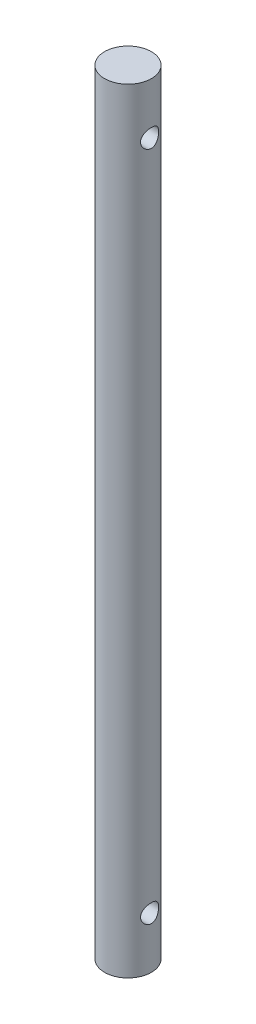
ISO-10303-21;
HEADER;
FILE_DESCRIPTION(('STEP AP214'),'2;1');
FILE_NAME('part.step','',(''),(''),'','','');
FILE_SCHEMA(('AUTOMOTIVE_DESIGN { 1 0 10303 214 1 1 1 1 }'));
ENDSEC;
DATA;
#1=APPLICATION_CONTEXT('core data for automotive mechanical design processes');
#2=APPLICATION_PROTOCOL_DEFINITION('international standard','automotive_design',2000,#1);
#3=PRODUCT_CONTEXT('',#1,'mechanical');
#4=PRODUCT('Part','Part','',(#3));
#5=PRODUCT_RELATED_PRODUCT_CATEGORY('part','',(#4));
#6=PRODUCT_DEFINITION_FORMATION('','',#4);
#7=PRODUCT_DEFINITION_CONTEXT('part definition',#1,'design');
#8=PRODUCT_DEFINITION('design','',#6,#7);
#9=PRODUCT_DEFINITION_SHAPE('','',#8);
#10=(LENGTH_UNIT() NAMED_UNIT(*) SI_UNIT(.MILLI.,.METRE.));
#11=(NAMED_UNIT(*) PLANE_ANGLE_UNIT() SI_UNIT($,.RADIAN.));
#12=(NAMED_UNIT(*) SI_UNIT($,.STERADIAN.) SOLID_ANGLE_UNIT());
#13=UNCERTAINTY_MEASURE_WITH_UNIT(LENGTH_MEASURE(1.E-05),#10,'distance_accuracy_value','');
#14=(GEOMETRIC_REPRESENTATION_CONTEXT(3) GLOBAL_UNCERTAINTY_ASSIGNED_CONTEXT((#13)) GLOBAL_UNIT_ASSIGNED_CONTEXT((#10,
#11,#12)) REPRESENTATION_CONTEXT('',''));
#15=CARTESIAN_POINT('',(0.,0.,0.));
#16=DIRECTION('',(0.,0.,1.));
#17=DIRECTION('',(1.,0.,0.));
#18=AXIS2_PLACEMENT_3D('',#15,#16,#17);
#19=CARTESIAN_POINT('',(0.,65.0875,0.));
#20=DIRECTION('',(0.,-1.,0.));
#21=DIRECTION('',(0.,0.,-1.));
#22=AXIS2_PLACEMENT_3D('',#19,#20,#21);
#23=CYLINDRICAL_SURFACE('',#22,3.937);
#24=CARTESIAN_POINT('',(3.63006790570094,-56.4515,1.524));
#25=CARTESIAN_POINT('',(3.63006392196932,-56.3694185894616,1.52400412035066));
#26=CARTESIAN_POINT('',(3.63288199859455,-56.2873632234675,1.51734686728013));
#27=CARTESIAN_POINT('',(3.64376363075136,-56.1257392441566,1.49102551795401));
#28=CARTESIAN_POINT('',(3.65182677460791,-56.0461704361884,1.47136244249785));
#29=CARTESIAN_POINT('',(3.6721512108098,-55.8919039224062,1.41986956483644));
#30=CARTESIAN_POINT('',(3.68440183779468,-55.8171944099924,1.38807064841585));
#31=CARTESIAN_POINT('',(3.7117031759989,-55.6741408355735,1.31331910944269));
#32=CARTESIAN_POINT('',(3.72675478317828,-55.6057988208904,1.27036291622537));
#33=CARTESIAN_POINT('',(3.75885617148866,-55.4737953016217,1.17207643777501));
#34=CARTESIAN_POINT('',(3.77596732043932,-55.4105186743337,1.11624915240625));
#35=CARTESIAN_POINT('',(3.80974974039917,-55.2939519696903,0.994857825404264));
#36=CARTESIAN_POINT('',(3.82642090870463,-55.2406642066054,0.929291533680356));
#37=CARTESIAN_POINT('',(3.85818046351315,-55.1436994015494,0.787328387495312));
#38=CARTESIAN_POINT('',(3.87318859814161,-55.1004454460719,0.710622985871329));
#39=CARTESIAN_POINT('',(3.89918868835105,-55.0276173154621,0.550339871754845));
#40=CARTESIAN_POINT('',(3.91018213528473,-54.9980380594442,0.466764725357692));
#41=CARTESIAN_POINT('',(3.92647815959769,-54.9547630644324,0.299164096082746));
#42=CARTESIAN_POINT('',(3.93201769140294,-54.94040367079,0.215333465766335));
#43=CARTESIAN_POINT('',(3.93763500854755,-54.925844509362,0.0462814968620197));
#44=CARTESIAN_POINT('',(3.93771468660526,-54.9256398346873,-0.0389393495447753));
#45=CARTESIAN_POINT('',(3.9325509150802,-54.9390202747287,-0.203576795529883));
#46=CARTESIAN_POINT('',(3.92758757656553,-54.9518797449542,-0.283062713277183));
#47=CARTESIAN_POINT('',(3.91326770706005,-54.9897962981019,-0.438646661967985));
#48=CARTESIAN_POINT('',(3.90391086304566,-55.0148542501327,-0.514744451094868));
#49=CARTESIAN_POINT('',(3.88155090054753,-55.0767683351308,-0.662736972184929));
#50=CARTESIAN_POINT('',(3.86849573953941,-55.1137940098516,-0.734552586623089));
#51=CARTESIAN_POINT('',(3.84004811745613,-55.1984384603779,-0.871133438098779));
#52=CARTESIAN_POINT('',(3.82465487778109,-55.2460607674168,-0.935896314133752));
#53=CARTESIAN_POINT('',(3.79198062430732,-55.3539903530552,-1.06078967159706));
#54=CARTESIAN_POINT('',(3.77464173906282,-55.4149006822682,-1.12038466331181));
#55=CARTESIAN_POINT('',(3.74077990318478,-55.5459380327954,-1.22872443261319));
#56=CARTESIAN_POINT('',(3.72425718706006,-55.6160676821356,-1.2774661056795));
#57=CARTESIAN_POINT('',(3.69351980093699,-55.7657991429958,-1.36383323325818));
#58=CARTESIAN_POINT('',(3.67937314495566,-55.845593901206,-1.40115037858328));
#59=CARTESIAN_POINT('',(3.655780521877,-56.01102790908,-1.46160994964083));
#60=CARTESIAN_POINT('',(3.6463317324494,-56.0966636144324,-1.48476088791797));
#61=CARTESIAN_POINT('',(3.6338795344506,-56.2660311521115,-1.51497253584761));
#62=CARTESIAN_POINT('',(3.63053374010194,-56.3495848206623,-1.52288944953804));
#63=CARTESIAN_POINT('',(3.629694021156,-56.5168754850522,-1.52489152244753));
#64=CARTESIAN_POINT('',(3.63219849133477,-56.6006124243059,-1.51898047584874));
#65=CARTESIAN_POINT('',(3.64242760186809,-56.7613312335742,-1.49427237835433));
#66=CARTESIAN_POINT('',(3.64987458109633,-56.8384381411854,-1.47616000413786));
#67=CARTESIAN_POINT('',(3.66881307557071,-56.9884758222614,-1.42843755654595));
#68=CARTESIAN_POINT('',(3.68030545204968,-57.0614057026234,-1.39882503474207));
#69=CARTESIAN_POINT('',(3.70659005189264,-57.2041877763946,-1.32764749506203));
#70=CARTESIAN_POINT('',(3.72149353211344,-57.273808857766,-1.28566119903305));
#71=CARTESIAN_POINT('',(3.7527424849571,-57.4053195286811,-1.19136765798977));
#72=CARTESIAN_POINT('',(3.76908851313204,-57.4672061171631,-1.13905642697613));
#73=CARTESIAN_POINT('',(3.80273012971905,-57.5858823083394,-1.02137266386875));
#74=CARTESIAN_POINT('',(3.82001427571689,-57.6420346182233,-0.95535186397952));
#75=CARTESIAN_POINT('',(3.8525235323814,-57.7425504431739,-0.814405063692821));
#76=CARTESIAN_POINT('',(3.86774860184767,-57.7869137223692,-0.739478885162574));
#77=CARTESIAN_POINT('',(3.89443984652869,-57.8623560200187,-0.582756551510209));
#78=CARTESIAN_POINT('',(3.9059136278,-57.8934619582545,-0.500974725424003));
#79=CARTESIAN_POINT('',(3.92381898619296,-57.9412850973965,-0.332789756208421));
#80=CARTESIAN_POINT('',(3.93025310852282,-57.9580095618801,-0.246388969403522));
#81=CARTESIAN_POINT('',(3.93709842449676,-57.9757739657005,-0.0771601695373863));
#82=CARTESIAN_POINT('',(3.93785642841778,-57.9777171634222,0.00555978589423762));
#83=CARTESIAN_POINT('',(3.93418391811429,-57.9682168183075,0.170101204234533));
#84=CARTESIAN_POINT('',(3.92975410087117,-57.9567750737323,0.251922786348678));
#85=CARTESIAN_POINT('',(3.9163695272204,-57.9214701997757,0.41006237101338));
#86=CARTESIAN_POINT('',(3.90754178075952,-57.8979551877084,0.486469678969577));
#87=CARTESIAN_POINT('',(3.88629298168385,-57.8395268289889,0.634251382845558));
#88=CARTESIAN_POINT('',(3.87387124907046,-57.8046113251507,0.705624823153146));
#89=CARTESIAN_POINT('',(3.84599897545267,-57.7226650963068,0.84469416671026));
#90=CARTESIAN_POINT('',(3.83044080082452,-57.6751762892121,0.912098146165358));
#91=CARTESIAN_POINT('',(3.7981899168359,-57.5701376574114,1.03825294510428));
#92=CARTESIAN_POINT('',(3.78149679436115,-57.5125841571031,1.09700058882251));
#93=CARTESIAN_POINT('',(3.74768184272663,-57.3851513518241,1.20763729241235));
#94=CARTESIAN_POINT('',(3.73058992330116,-57.3147560376455,1.25894353046613));
#95=CARTESIAN_POINT('',(3.69896474901265,-57.165808736982,1.34904293086858));
#96=CARTESIAN_POINT('',(3.68443209475372,-57.087254842713,1.38783315775328));
#97=CARTESIAN_POINT('',(3.65891372864456,-56.918099979637,1.45384879822846));
#98=CARTESIAN_POINT('',(3.64825950453265,-56.8270387458785,1.48003811335499));
#99=CARTESIAN_POINT('',(3.63384161875155,-56.6411380611249,1.5151044878055));
#100=CARTESIAN_POINT('',(3.63007250679594,-56.5463016593943,1.52399524111394));
#101=CARTESIAN_POINT('',(3.63006790570094,-56.4515,1.524));
#102=B_SPLINE_CURVE_WITH_KNOTS('',3,(#24,#25,#26,#27,#28,#29,#30,#31,#32,#33,#34,#35,#36,#37,
#38,#39,#40,#41,#42,#43,#44,#45,#46,#47,#48,#49,#50,#51,#52,#53,#54,#55,#56,#57,#58,#59,#60,#61,
#62,#63,#64,#65,#66,#67,#68,#69,#70,#71,#72,#73,#74,#75,#76,#77,#78,#79,#80,#81,#82,#83,#84,#85,
#86,#87,#88,#89,#90,#91,#92,#93,#94,#95,#96,#97,#98,#99,#100,#101),.UNSPECIFIED.,.T.,.F.,(4,2,2,
2,2,2,2,2,2,2,2,2,2,2,2,2,2,2,2,2,2,2,2,2,2,2,2,2,2,2,2,2,2,2,2,2,2,2,4),(0.,0.245890638436702,
0.491761979728066,0.737011705411337,0.98234001531125,1.23950407157877,1.49672763546637,
1.76336466692882,2.02990254862958,2.28426866988906,2.53854661188861,2.77943350622572,
3.02033756560857,3.26481609971088,3.50937622644457,3.7690861910217,4.02887034876419,
4.29514796378378,4.56126541371713,4.81193116446014,5.06252814439809,5.30011967937874,
5.5377618263249,5.7846762426117,6.03168616870701,6.29557552180794,6.5594701543314,
6.82282635093512,7.08604945731724,7.3330473236336,7.58001200970691,7.82022535837641,
8.06048418626323,8.31111863731233,8.56184481135103,8.82688107877239,9.09197946181807,
9.37620113893591,9.66019772720608),.UNSPECIFIED.);
#103=CARTESIAN_POINT('',(3.63006790570094,-56.4515,1.524));
#104=VERTEX_POINT('',#103);
#105=EDGE_CURVE('E47',#104,#104,#102,.T.);
#106=ORIENTED_EDGE('',*,*,#105,.T.);
#107=EDGE_LOOP('',(#106));
#108=FACE_BOUND('',#107,.T.);
#109=CARTESIAN_POINT('',(-3.63006790570094,-56.4515,1.524));
#110=CARTESIAN_POINT('',(-3.63006392196932,-56.5335814105384,1.52400412035066));
#111=CARTESIAN_POINT('',(-3.63288199859455,-56.6156367765325,1.51734686728013));
#112=CARTESIAN_POINT('',(-3.64376363075136,-56.7772607558434,1.49102551795401));
#113=CARTESIAN_POINT('',(-3.65182677460791,-56.8568295638116,1.47136244249785));
#114=CARTESIAN_POINT('',(-3.6721512108098,-57.0110960775938,1.41986956483644));
#115=CARTESIAN_POINT('',(-3.68440183779468,-57.0858055900076,1.38807064841585));
#116=CARTESIAN_POINT('',(-3.7117031759989,-57.2288591644265,1.31331910944269));
#117=CARTESIAN_POINT('',(-3.72675478317828,-57.2972011791096,1.27036291622537));
#118=CARTESIAN_POINT('',(-3.75885617148866,-57.4292046983783,1.17207643777501));
#119=CARTESIAN_POINT('',(-3.77596732043932,-57.4924813256663,1.11624915240625));
#120=CARTESIAN_POINT('',(-3.80974974039917,-57.6090480303097,0.994857825404267));
#121=CARTESIAN_POINT('',(-3.82642090870463,-57.6623357933946,0.929291533680357));
#122=CARTESIAN_POINT('',(-3.85818046351315,-57.7593005984506,0.787328387495311));
#123=CARTESIAN_POINT('',(-3.87318859814161,-57.8025545539281,0.710622985871329));
#124=CARTESIAN_POINT('',(-3.89918868835105,-57.8753826845379,0.550339871754845));
#125=CARTESIAN_POINT('',(-3.91018213528473,-57.9049619405558,0.466764725357692));
#126=CARTESIAN_POINT('',(-3.92647815959769,-57.9482369355676,0.299164096082746));
#127=CARTESIAN_POINT('',(-3.93201769140294,-57.96259632921,0.215333465766335));
#128=CARTESIAN_POINT('',(-3.93763500854755,-57.9771554906379,0.0462814968620197));
#129=CARTESIAN_POINT('',(-3.93771468660526,-57.9773601653127,-0.0389393495447753));
#130=CARTESIAN_POINT('',(-3.9325509150802,-57.9639797252713,-0.203576795529883));
#131=CARTESIAN_POINT('',(-3.92758757656553,-57.9511202550458,-0.283062713277183));
#132=CARTESIAN_POINT('',(-3.91326770706005,-57.9132037018981,-0.438646661967985));
#133=CARTESIAN_POINT('',(-3.90391086304566,-57.8881457498673,-0.514744451094868));
#134=CARTESIAN_POINT('',(-3.88155090054753,-57.8262316648692,-0.662736972184929));
#135=CARTESIAN_POINT('',(-3.86849573953941,-57.7892059901484,-0.734552586623089));
#136=CARTESIAN_POINT('',(-3.84004811745613,-57.7045615396221,-0.871133438098779));
#137=CARTESIAN_POINT('',(-3.82465487778109,-57.6569392325832,-0.935896314133752));
#138=CARTESIAN_POINT('',(-3.79198062430732,-57.5490096469448,-1.06078967159706));
#139=CARTESIAN_POINT('',(-3.77464173906282,-57.4880993177318,-1.12038466331181));
#140=CARTESIAN_POINT('',(-3.74077990318478,-57.3570619672045,-1.22872443261319));
#141=CARTESIAN_POINT('',(-3.72425718706006,-57.2869323178643,-1.2774661056795));
#142=CARTESIAN_POINT('',(-3.69351980093699,-57.1372008570042,-1.36383323325818));
#143=CARTESIAN_POINT('',(-3.67937314495566,-57.057406098794,-1.40115037858328));
#144=CARTESIAN_POINT('',(-3.655780521877,-56.89197209092,-1.46160994964083));
#145=CARTESIAN_POINT('',(-3.6463317324494,-56.8063363855676,-1.48476088791797));
#146=CARTESIAN_POINT('',(-3.6338795344506,-56.6369688478885,-1.51497253584761));
#147=CARTESIAN_POINT('',(-3.63053374010194,-56.5534151793377,-1.52288944953804));
#148=CARTESIAN_POINT('',(-3.629694021156,-56.3861245149478,-1.52489152244753));
#149=CARTESIAN_POINT('',(-3.63219849133477,-56.3023875756941,-1.51898047584874));
#150=CARTESIAN_POINT('',(-3.64242760186809,-56.1416687664258,-1.49427237835433));
#151=CARTESIAN_POINT('',(-3.64987458109633,-56.0645618588145,-1.47616000413786));
#152=CARTESIAN_POINT('',(-3.66881307557071,-55.9145241777385,-1.42843755654595));
#153=CARTESIAN_POINT('',(-3.68030545204968,-55.8415942973766,-1.39882503474207));
#154=CARTESIAN_POINT('',(-3.70659005189264,-55.6988122236054,-1.32764749506203));
#155=CARTESIAN_POINT('',(-3.72149353211344,-55.629191142234,-1.28566119903305));
#156=CARTESIAN_POINT('',(-3.7527424849571,-55.4976804713188,-1.19136765798977));
#157=CARTESIAN_POINT('',(-3.76908851313204,-55.4357938828369,-1.13905642697613));
#158=CARTESIAN_POINT('',(-3.80273012971905,-55.3171176916606,-1.02137266386875));
#159=CARTESIAN_POINT('',(-3.82001427571689,-55.2609653817767,-0.95535186397952));
#160=CARTESIAN_POINT('',(-3.8525235323814,-55.1604495568261,-0.814405063692821));
#161=CARTESIAN_POINT('',(-3.86774860184767,-55.1160862776308,-0.739478885162574));
#162=CARTESIAN_POINT('',(-3.89443984652869,-55.0406439799813,-0.582756551510209));
#163=CARTESIAN_POINT('',(-3.9059136278,-55.0095380417455,-0.500974725424003));
#164=CARTESIAN_POINT('',(-3.92381898619296,-54.9617149026034,-0.332789756208421));
#165=CARTESIAN_POINT('',(-3.93025310852282,-54.9449904381199,-0.246388969403522));
#166=CARTESIAN_POINT('',(-3.93709842449676,-54.9272260342995,-0.0771601695373863));
#167=CARTESIAN_POINT('',(-3.93785642841778,-54.9252828365778,0.00555978589423761));
#168=CARTESIAN_POINT('',(-3.93418391811429,-54.9347831816924,0.170101204234533));
#169=CARTESIAN_POINT('',(-3.92975410087117,-54.9462249262677,0.251922786348678));
#170=CARTESIAN_POINT('',(-3.9163695272204,-54.9815298002243,0.41006237101338));
#171=CARTESIAN_POINT('',(-3.90754178075952,-55.0050448122916,0.486469678969576));
#172=CARTESIAN_POINT('',(-3.88629298168385,-55.0634731710111,0.634251382845558));
#173=CARTESIAN_POINT('',(-3.87387124907046,-55.0983886748493,0.705624823153147));
#174=CARTESIAN_POINT('',(-3.84599897545267,-55.1803349036932,0.844694166710258));
#175=CARTESIAN_POINT('',(-3.83044080082452,-55.2278237107879,0.912098146165353));
#176=CARTESIAN_POINT('',(-3.7981899168359,-55.3328623425886,1.03825294510428));
#177=CARTESIAN_POINT('',(-3.78149679436115,-55.3904158428968,1.09700058882251));
#178=CARTESIAN_POINT('',(-3.74768184272663,-55.5178486481759,1.20763729241235));
#179=CARTESIAN_POINT('',(-3.73058992330116,-55.5882439623545,1.25894353046613));
#180=CARTESIAN_POINT('',(-3.69896474901265,-55.737191263018,1.34904293086858));
#181=CARTESIAN_POINT('',(-3.68443209475372,-55.815745157287,1.38783315775328));
#182=CARTESIAN_POINT('',(-3.65891372864456,-55.984900020363,1.45384879822845));
#183=CARTESIAN_POINT('',(-3.64825950453265,-56.0759612541215,1.48003811335499));
#184=CARTESIAN_POINT('',(-3.63384161875155,-56.2618619388751,1.5151044878055));
#185=CARTESIAN_POINT('',(-3.63007250679594,-56.3566983406057,1.52399524111394));
#186=CARTESIAN_POINT('',(-3.63006790570094,-56.4515,1.524));
#187=B_SPLINE_CURVE_WITH_KNOTS('',3,(#109,#110,#111,#112,#113,#114,#115,#116,#117,#118,#119,
#120,#121,#122,#123,#124,#125,#126,#127,#128,#129,#130,#131,#132,#133,#134,#135,#136,#137,#138,
#139,#140,#141,#142,#143,#144,#145,#146,#147,#148,#149,#150,#151,#152,#153,#154,#155,#156,#157,
#158,#159,#160,#161,#162,#163,#164,#165,#166,#167,#168,#169,#170,#171,#172,#173,#174,#175,#176,
#177,#178,#179,#180,#181,#182,#183,#184,#185,#186),.UNSPECIFIED.,.T.,.F.,(4,2,2,2,2,2,2,2,2,2,2,
2,2,2,2,2,2,2,2,2,2,2,2,2,2,2,2,2,2,2,2,2,2,2,2,2,2,2,4),(0.,0.245890638436702,
0.491761979728066,0.737011705411337,0.98234001531125,1.23950407157877,1.49672763546637,
1.76336466692882,2.02990254862958,2.28426866988906,2.53854661188861,2.77943350622572,
3.02033756560857,3.26481609971088,3.50937622644457,3.7690861910217,4.02887034876419,
4.29514796378378,4.56126541371713,4.81193116446014,5.06252814439809,5.30011967937874,
5.5377618263249,5.7846762426117,6.03168616870701,6.29557552180794,6.5594701543314,
6.82282635093512,7.08604945731724,7.3330473236336,7.58001200970691,7.82022535837641,
8.06048418626323,8.31111863731232,8.56184481135103,8.82688107877238,9.09197946181806,
9.37620113893591,9.66019772720608),.UNSPECIFIED.);
#188=CARTESIAN_POINT('',(-3.63006790570094,-56.4515,1.524));
#189=VERTEX_POINT('',#188);
#190=EDGE_CURVE('E103',#189,#189,#187,.T.);
#191=ORIENTED_EDGE('',*,*,#190,.T.);
#192=EDGE_LOOP('',(#191));
#193=FACE_BOUND('',#192,.T.);
#194=CARTESIAN_POINT('',(0.,65.0875,0.));
#195=DIRECTION('',(0.,1.,0.));
#196=DIRECTION('',(0.,0.,1.));
#197=AXIS2_PLACEMENT_3D('',#194,#195,#196);
#198=CIRCLE('',#197,3.937);
#199=CARTESIAN_POINT('',(0.,65.0875,3.937));
#200=VERTEX_POINT('',#199);
#201=EDGE_CURVE('E10',#200,#200,#198,.T.);
#202=ORIENTED_EDGE('',*,*,#201,.F.);
#203=EDGE_LOOP('',(#202));
#204=FACE_BOUND('',#203,.T.);
#205=CARTESIAN_POINT('',(0.,-65.0875,0.));
#206=DIRECTION('',(0.,1.,0.));
#207=DIRECTION('',(0.,0.,1.));
#208=AXIS2_PLACEMENT_3D('',#205,#206,#207);
#209=CIRCLE('',#208,3.937);
#210=CARTESIAN_POINT('',(0.,-65.0875,3.937));
#211=VERTEX_POINT('',#210);
#212=EDGE_CURVE('E56',#211,#211,#209,.T.);
#213=ORIENTED_EDGE('',*,*,#212,.T.);
#214=EDGE_LOOP('',(#213));
#215=FACE_BOUND('',#214,.T.);
#216=CARTESIAN_POINT('',(-3.63006790570094,56.4515,1.524));
#217=CARTESIAN_POINT('',(-3.63006392196932,56.5335814105384,1.52400412035066));
#218=CARTESIAN_POINT('',(-3.63288199859455,56.6156367765325,1.51734686728013));
#219=CARTESIAN_POINT('',(-3.64376363075136,56.7772607558434,1.49102551795401));
#220=CARTESIAN_POINT('',(-3.65182677460791,56.8568295638116,1.47136244249785));
#221=CARTESIAN_POINT('',(-3.6721512108098,57.0110960775938,1.41986956483644));
#222=CARTESIAN_POINT('',(-3.68440183779468,57.0858055900076,1.38807064841585));
#223=CARTESIAN_POINT('',(-3.7117031759989,57.2288591644265,1.31331910944269));
#224=CARTESIAN_POINT('',(-3.72675478317828,57.2972011791096,1.27036291622537));
#225=CARTESIAN_POINT('',(-3.75885617148866,57.4292046983783,1.17207643777501));
#226=CARTESIAN_POINT('',(-3.77596732043932,57.4924813256663,1.11624915240625));
#227=CARTESIAN_POINT('',(-3.80974974039917,57.6090480303097,0.994857825404267));
#228=CARTESIAN_POINT('',(-3.82642090870463,57.6623357933946,0.929291533680357));
#229=CARTESIAN_POINT('',(-3.85818046351315,57.7593005984506,0.787328387495311));
#230=CARTESIAN_POINT('',(-3.87318859814161,57.8025545539281,0.710622985871329));
#231=CARTESIAN_POINT('',(-3.89918868835105,57.8753826845379,0.550339871754845));
#232=CARTESIAN_POINT('',(-3.91018213528473,57.9049619405558,0.466764725357692));
#233=CARTESIAN_POINT('',(-3.92647815959769,57.9482369355676,0.299164096082746));
#234=CARTESIAN_POINT('',(-3.93201769140294,57.96259632921,0.215333465766335));
#235=CARTESIAN_POINT('',(-3.93763500854755,57.9771554906379,0.0462814968620197));
#236=CARTESIAN_POINT('',(-3.93771468660526,57.9773601653127,-0.0389393495447753));
#237=CARTESIAN_POINT('',(-3.9325509150802,57.9639797252713,-0.203576795529883));
#238=CARTESIAN_POINT('',(-3.92758757656553,57.9511202550458,-0.283062713277183));
#239=CARTESIAN_POINT('',(-3.91326770706005,57.9132037018981,-0.438646661967985));
#240=CARTESIAN_POINT('',(-3.90391086304566,57.8881457498673,-0.514744451094868));
#241=CARTESIAN_POINT('',(-3.88155090054753,57.8262316648692,-0.662736972184929));
#242=CARTESIAN_POINT('',(-3.86849573953941,57.7892059901484,-0.734552586623089));
#243=CARTESIAN_POINT('',(-3.84004811745613,57.7045615396221,-0.871133438098779));
#244=CARTESIAN_POINT('',(-3.82465487778109,57.6569392325832,-0.935896314133752));
#245=CARTESIAN_POINT('',(-3.79198062430732,57.5490096469448,-1.06078967159706));
#246=CARTESIAN_POINT('',(-3.77464173906282,57.4880993177318,-1.12038466331181));
#247=CARTESIAN_POINT('',(-3.74077990318478,57.3570619672045,-1.22872443261319));
#248=CARTESIAN_POINT('',(-3.72425718706006,57.2869323178643,-1.2774661056795));
#249=CARTESIAN_POINT('',(-3.69351980093699,57.1372008570042,-1.36383323325818));
#250=CARTESIAN_POINT('',(-3.67937314495566,57.057406098794,-1.40115037858328));
#251=CARTESIAN_POINT('',(-3.655780521877,56.89197209092,-1.46160994964083));
#252=CARTESIAN_POINT('',(-3.6463317324494,56.8063363855676,-1.48476088791797));
#253=CARTESIAN_POINT('',(-3.6338795344506,56.6369688478885,-1.51497253584761));
#254=CARTESIAN_POINT('',(-3.63053374010194,56.5534151793377,-1.52288944953804));
#255=CARTESIAN_POINT('',(-3.629694021156,56.3861245149478,-1.52489152244753));
#256=CARTESIAN_POINT('',(-3.63219849133477,56.3023875756941,-1.51898047584874));
#257=CARTESIAN_POINT('',(-3.64242760186809,56.1416687664258,-1.49427237835433));
#258=CARTESIAN_POINT('',(-3.64987458109633,56.0645618588145,-1.47616000413786));
#259=CARTESIAN_POINT('',(-3.66881307557071,55.9145241777385,-1.42843755654595));
#260=CARTESIAN_POINT('',(-3.68030545204968,55.8415942973766,-1.39882503474207));
#261=CARTESIAN_POINT('',(-3.70659005189264,55.6988122236054,-1.32764749506203));
#262=CARTESIAN_POINT('',(-3.72149353211344,55.629191142234,-1.28566119903305));
#263=CARTESIAN_POINT('',(-3.7527424849571,55.4976804713188,-1.19136765798977));
#264=CARTESIAN_POINT('',(-3.76908851313204,55.4357938828369,-1.13905642697613));
#265=CARTESIAN_POINT('',(-3.80273012971905,55.3171176916606,-1.02137266386875));
#266=CARTESIAN_POINT('',(-3.82001427571689,55.2609653817767,-0.95535186397952));
#267=CARTESIAN_POINT('',(-3.8525235323814,55.1604495568261,-0.814405063692821));
#268=CARTESIAN_POINT('',(-3.86774860184767,55.1160862776308,-0.739478885162574));
#269=CARTESIAN_POINT('',(-3.89443984652869,55.0406439799813,-0.582756551510209));
#270=CARTESIAN_POINT('',(-3.9059136278,55.0095380417455,-0.500974725424003));
#271=CARTESIAN_POINT('',(-3.92381898619296,54.9617149026034,-0.332789756208421));
#272=CARTESIAN_POINT('',(-3.93025310852282,54.9449904381199,-0.246388969403522));
#273=CARTESIAN_POINT('',(-3.93709842449676,54.9272260342995,-0.0771601695373863));
#274=CARTESIAN_POINT('',(-3.93785642841778,54.9252828365778,0.00555978589423761));
#275=CARTESIAN_POINT('',(-3.93418391811429,54.9347831816924,0.170101204234533));
#276=CARTESIAN_POINT('',(-3.92975410087117,54.9462249262677,0.251922786348678));
#277=CARTESIAN_POINT('',(-3.9163695272204,54.9815298002243,0.41006237101338));
#278=CARTESIAN_POINT('',(-3.90754178075952,55.0050448122916,0.486469678969576));
#279=CARTESIAN_POINT('',(-3.88629298168385,55.0634731710111,0.634251382845558));
#280=CARTESIAN_POINT('',(-3.87387124907046,55.0983886748493,0.705624823153147));
#281=CARTESIAN_POINT('',(-3.84599897545267,55.1803349036932,0.844694166710258));
#282=CARTESIAN_POINT('',(-3.83044080082452,55.2278237107879,0.912098146165353));
#283=CARTESIAN_POINT('',(-3.7981899168359,55.3328623425886,1.03825294510428));
#284=CARTESIAN_POINT('',(-3.78149679436115,55.3904158428968,1.09700058882251));
#285=CARTESIAN_POINT('',(-3.74768184272663,55.5178486481759,1.20763729241235));
#286=CARTESIAN_POINT('',(-3.73058992330116,55.5882439623545,1.25894353046613));
#287=CARTESIAN_POINT('',(-3.69896474901265,55.737191263018,1.34904293086858));
#288=CARTESIAN_POINT('',(-3.68443209475372,55.815745157287,1.38783315775328));
#289=CARTESIAN_POINT('',(-3.65891372864456,55.984900020363,1.45384879822845));
#290=CARTESIAN_POINT('',(-3.64825950453265,56.0759612541215,1.48003811335499));
#291=CARTESIAN_POINT('',(-3.63384161875155,56.2618619388751,1.5151044878055));
#292=CARTESIAN_POINT('',(-3.63007250679594,56.3566983406057,1.52399524111394));
#293=CARTESIAN_POINT('',(-3.63006790570094,56.4515,1.524));
#294=B_SPLINE_CURVE_WITH_KNOTS('',3,(#216,#217,#218,#219,#220,#221,#222,#223,#224,#225,#226,
#227,#228,#229,#230,#231,#232,#233,#234,#235,#236,#237,#238,#239,#240,#241,#242,#243,#244,#245,
#246,#247,#248,#249,#250,#251,#252,#253,#254,#255,#256,#257,#258,#259,#260,#261,#262,#263,#264,
#265,#266,#267,#268,#269,#270,#271,#272,#273,#274,#275,#276,#277,#278,#279,#280,#281,#282,#283,
#284,#285,#286,#287,#288,#289,#290,#291,#292,#293),.UNSPECIFIED.,.T.,.F.,(4,2,2,2,2,2,2,2,2,2,2,
2,2,2,2,2,2,2,2,2,2,2,2,2,2,2,2,2,2,2,2,2,2,2,2,2,2,2,4),(0.,0.245890638436702,
0.491761979728066,0.737011705411337,0.98234001531125,1.23950407157877,1.49672763546637,
1.76336466692882,2.02990254862958,2.28426866988906,2.53854661188861,2.77943350622572,
3.02033756560857,3.26481609971088,3.50937622644457,3.7690861910217,4.02887034876419,
4.29514796378378,4.56126541371713,4.81193116446014,5.06252814439809,5.30011967937874,
5.5377618263249,5.7846762426117,6.03168616870701,6.29557552180794,6.5594701543314,
6.82282635093512,7.08604945731724,7.3330473236336,7.58001200970691,7.82022535837641,
8.06048418626323,8.31111863731232,8.56184481135103,8.82688107877238,9.09197946181806,
9.37620113893591,9.66019772720608),.UNSPECIFIED.);
#295=CARTESIAN_POINT('',(-3.63006790570094,56.4515,1.524));
#296=VERTEX_POINT('',#295);
#297=EDGE_CURVE('E65',#296,#296,#294,.T.);
#298=ORIENTED_EDGE('',*,*,#297,.F.);
#299=EDGE_LOOP('',(#298));
#300=FACE_BOUND('',#299,.T.);
#301=CARTESIAN_POINT('',(3.63006790570094,56.4515,1.524));
#302=CARTESIAN_POINT('',(3.63006392196932,56.3694185894616,1.52400412035066));
#303=CARTESIAN_POINT('',(3.63288199859455,56.2873632234675,1.51734686728013));
#304=CARTESIAN_POINT('',(3.64376363075136,56.1257392441566,1.49102551795401));
#305=CARTESIAN_POINT('',(3.65182677460791,56.0461704361884,1.47136244249785));
#306=CARTESIAN_POINT('',(3.6721512108098,55.8919039224062,1.41986956483644));
#307=CARTESIAN_POINT('',(3.68440183779468,55.8171944099924,1.38807064841585));
#308=CARTESIAN_POINT('',(3.7117031759989,55.6741408355735,1.31331910944269));
#309=CARTESIAN_POINT('',(3.72675478317828,55.6057988208904,1.27036291622537));
#310=CARTESIAN_POINT('',(3.75885617148866,55.4737953016217,1.17207643777501));
#311=CARTESIAN_POINT('',(3.77596732043932,55.4105186743337,1.11624915240625));
#312=CARTESIAN_POINT('',(3.80974974039917,55.2939519696903,0.994857825404264));
#313=CARTESIAN_POINT('',(3.82642090870463,55.2406642066054,0.929291533680356));
#314=CARTESIAN_POINT('',(3.85818046351315,55.1436994015494,0.787328387495312));
#315=CARTESIAN_POINT('',(3.87318859814161,55.1004454460719,0.710622985871329));
#316=CARTESIAN_POINT('',(3.89918868835105,55.0276173154621,0.550339871754845));
#317=CARTESIAN_POINT('',(3.91018213528473,54.9980380594442,0.466764725357692));
#318=CARTESIAN_POINT('',(3.92647815959769,54.9547630644324,0.299164096082746));
#319=CARTESIAN_POINT('',(3.93201769140294,54.94040367079,0.215333465766335));
#320=CARTESIAN_POINT('',(3.93763500854755,54.925844509362,0.0462814968620197));
#321=CARTESIAN_POINT('',(3.93771468660526,54.9256398346873,-0.0389393495447753));
#322=CARTESIAN_POINT('',(3.9325509150802,54.9390202747287,-0.203576795529883));
#323=CARTESIAN_POINT('',(3.92758757656553,54.9518797449542,-0.283062713277183));
#324=CARTESIAN_POINT('',(3.91326770706005,54.9897962981019,-0.438646661967985));
#325=CARTESIAN_POINT('',(3.90391086304566,55.0148542501327,-0.514744451094868));
#326=CARTESIAN_POINT('',(3.88155090054753,55.0767683351308,-0.662736972184929));
#327=CARTESIAN_POINT('',(3.86849573953941,55.1137940098516,-0.734552586623089));
#328=CARTESIAN_POINT('',(3.84004811745613,55.1984384603779,-0.871133438098779));
#329=CARTESIAN_POINT('',(3.82465487778109,55.2460607674168,-0.935896314133752));
#330=CARTESIAN_POINT('',(3.79198062430732,55.3539903530552,-1.06078967159706));
#331=CARTESIAN_POINT('',(3.77464173906282,55.4149006822682,-1.12038466331181));
#332=CARTESIAN_POINT('',(3.74077990318478,55.5459380327954,-1.22872443261319));
#333=CARTESIAN_POINT('',(3.72425718706006,55.6160676821356,-1.2774661056795));
#334=CARTESIAN_POINT('',(3.69351980093699,55.7657991429958,-1.36383323325818));
#335=CARTESIAN_POINT('',(3.67937314495566,55.845593901206,-1.40115037858328));
#336=CARTESIAN_POINT('',(3.655780521877,56.01102790908,-1.46160994964083));
#337=CARTESIAN_POINT('',(3.6463317324494,56.0966636144324,-1.48476088791797));
#338=CARTESIAN_POINT('',(3.6338795344506,56.2660311521115,-1.51497253584761));
#339=CARTESIAN_POINT('',(3.63053374010194,56.3495848206623,-1.52288944953804));
#340=CARTESIAN_POINT('',(3.629694021156,56.5168754850522,-1.52489152244753));
#341=CARTESIAN_POINT('',(3.63219849133477,56.6006124243059,-1.51898047584874));
#342=CARTESIAN_POINT('',(3.64242760186809,56.7613312335742,-1.49427237835433));
#343=CARTESIAN_POINT('',(3.64987458109633,56.8384381411854,-1.47616000413786));
#344=CARTESIAN_POINT('',(3.66881307557071,56.9884758222614,-1.42843755654595));
#345=CARTESIAN_POINT('',(3.68030545204968,57.0614057026234,-1.39882503474207));
#346=CARTESIAN_POINT('',(3.70659005189264,57.2041877763946,-1.32764749506203));
#347=CARTESIAN_POINT('',(3.72149353211344,57.273808857766,-1.28566119903305));
#348=CARTESIAN_POINT('',(3.7527424849571,57.4053195286811,-1.19136765798977));
#349=CARTESIAN_POINT('',(3.76908851313204,57.4672061171631,-1.13905642697613));
#350=CARTESIAN_POINT('',(3.80273012971905,57.5858823083394,-1.02137266386875));
#351=CARTESIAN_POINT('',(3.82001427571689,57.6420346182233,-0.95535186397952));
#352=CARTESIAN_POINT('',(3.8525235323814,57.7425504431739,-0.814405063692821));
#353=CARTESIAN_POINT('',(3.86774860184767,57.7869137223692,-0.739478885162574));
#354=CARTESIAN_POINT('',(3.89443984652869,57.8623560200187,-0.582756551510209));
#355=CARTESIAN_POINT('',(3.9059136278,57.8934619582545,-0.500974725424003));
#356=CARTESIAN_POINT('',(3.92381898619296,57.9412850973965,-0.332789756208421));
#357=CARTESIAN_POINT('',(3.93025310852282,57.9580095618801,-0.246388969403522));
#358=CARTESIAN_POINT('',(3.93709842449676,57.9757739657005,-0.0771601695373863));
#359=CARTESIAN_POINT('',(3.93785642841778,57.9777171634222,0.00555978589423762));
#360=CARTESIAN_POINT('',(3.93418391811429,57.9682168183075,0.170101204234533));
#361=CARTESIAN_POINT('',(3.92975410087117,57.9567750737323,0.251922786348678));
#362=CARTESIAN_POINT('',(3.9163695272204,57.9214701997757,0.41006237101338));
#363=CARTESIAN_POINT('',(3.90754178075952,57.8979551877084,0.486469678969577));
#364=CARTESIAN_POINT('',(3.88629298168385,57.8395268289889,0.634251382845558));
#365=CARTESIAN_POINT('',(3.87387124907046,57.8046113251507,0.705624823153146));
#366=CARTESIAN_POINT('',(3.84599897545267,57.7226650963068,0.84469416671026));
#367=CARTESIAN_POINT('',(3.83044080082452,57.6751762892121,0.912098146165358));
#368=CARTESIAN_POINT('',(3.7981899168359,57.5701376574114,1.03825294510428));
#369=CARTESIAN_POINT('',(3.78149679436115,57.5125841571031,1.09700058882251));
#370=CARTESIAN_POINT('',(3.74768184272663,57.3851513518241,1.20763729241235));
#371=CARTESIAN_POINT('',(3.73058992330116,57.3147560376455,1.25894353046613));
#372=CARTESIAN_POINT('',(3.69896474901265,57.165808736982,1.34904293086858));
#373=CARTESIAN_POINT('',(3.68443209475372,57.087254842713,1.38783315775328));
#374=CARTESIAN_POINT('',(3.65891372864456,56.918099979637,1.45384879822846));
#375=CARTESIAN_POINT('',(3.64825950453265,56.8270387458785,1.48003811335499));
#376=CARTESIAN_POINT('',(3.63384161875155,56.6411380611249,1.5151044878055));
#377=CARTESIAN_POINT('',(3.63007250679594,56.5463016593943,1.52399524111394));
#378=CARTESIAN_POINT('',(3.63006790570094,56.4515,1.524));
#379=B_SPLINE_CURVE_WITH_KNOTS('',3,(#301,#302,#303,#304,#305,#306,#307,#308,#309,#310,#311,
#312,#313,#314,#315,#316,#317,#318,#319,#320,#321,#322,#323,#324,#325,#326,#327,#328,#329,#330,
#331,#332,#333,#334,#335,#336,#337,#338,#339,#340,#341,#342,#343,#344,#345,#346,#347,#348,#349,
#350,#351,#352,#353,#354,#355,#356,#357,#358,#359,#360,#361,#362,#363,#364,#365,#366,#367,#368,
#369,#370,#371,#372,#373,#374,#375,#376,#377,#378),.UNSPECIFIED.,.T.,.F.,(4,2,2,2,2,2,2,2,2,2,2,
2,2,2,2,2,2,2,2,2,2,2,2,2,2,2,2,2,2,2,2,2,2,2,2,2,2,2,4),(0.,0.245890638436702,
0.491761979728066,0.737011705411337,0.98234001531125,1.23950407157877,1.49672763546637,
1.76336466692882,2.02990254862958,2.28426866988906,2.53854661188861,2.77943350622572,
3.02033756560857,3.26481609971088,3.50937622644457,3.7690861910217,4.02887034876419,
4.29514796378378,4.56126541371713,4.81193116446014,5.06252814439809,5.30011967937874,
5.5377618263249,5.7846762426117,6.03168616870701,6.29557552180794,6.5594701543314,
6.82282635093512,7.08604945731724,7.3330473236336,7.58001200970691,7.82022535837641,
8.06048418626323,8.31111863731233,8.56184481135103,8.82688107877239,9.09197946181807,
9.37620113893591,9.66019772720608),.UNSPECIFIED.);
#380=CARTESIAN_POINT('',(3.63006790570094,56.4515,1.524));
#381=VERTEX_POINT('',#380);
#382=EDGE_CURVE('E62',#381,#381,#379,.T.);
#383=ORIENTED_EDGE('',*,*,#382,.F.);
#384=EDGE_LOOP('',(#383));
#385=FACE_BOUND('',#384,.T.);
#386=ADVANCED_FACE('F43',(#108,#193,#204,#215,#300,#385),#23,.T.);
#387=CARTESIAN_POINT('',(0.,65.0875,0.));
#388=DIRECTION('',(0.,1.,0.));
#389=DIRECTION('',(0.,0.,1.));
#390=AXIS2_PLACEMENT_3D('',#387,#388,#389);
#391=PLANE('',#390);
#392=ORIENTED_EDGE('',*,*,#201,.T.);
#393=EDGE_LOOP('',(#392));
#394=FACE_BOUND('',#393,.T.);
#395=ADVANCED_FACE('F84',(#394),#391,.T.);
#396=CARTESIAN_POINT('',(0.,-65.0875,0.));
#397=DIRECTION('',(0.,1.,0.));
#398=DIRECTION('',(0.,0.,1.));
#399=AXIS2_PLACEMENT_3D('',#396,#397,#398);
#400=PLANE('',#399);
#401=ORIENTED_EDGE('',*,*,#212,.F.);
#402=EDGE_LOOP('',(#401));
#403=FACE_BOUND('',#402,.T.);
#404=ADVANCED_FACE('F81',(#403),#400,.F.);
#405=CARTESIAN_POINT('',(-6.6636602294902,56.4515,0.));
#406=DIRECTION('',(-1.,0.,0.));
#407=DIRECTION('',(0.,0.,1.));
#408=AXIS2_PLACEMENT_3D('',#405,#406,#407);
#409=CYLINDRICAL_SURFACE('',#408,1.524);
#410=ORIENTED_EDGE('',*,*,#297,.T.);
#411=EDGE_LOOP('',(#410));
#412=FACE_BOUND('',#411,.T.);
#413=ORIENTED_EDGE('',*,*,#382,.T.);
#414=EDGE_LOOP('',(#413));
#415=FACE_BOUND('',#414,.T.);
#416=ADVANCED_FACE('F76',(#412,#415),#409,.F.);
#417=CARTESIAN_POINT('',(-7.17141038878601,-56.4515,0.));
#418=DIRECTION('',(-1.,0.,0.));
#419=DIRECTION('',(0.,0.,1.));
#420=AXIS2_PLACEMENT_3D('',#417,#418,#419);
#421=CYLINDRICAL_SURFACE('',#420,1.524);
#422=ORIENTED_EDGE('',*,*,#190,.F.);
#423=EDGE_LOOP('',(#422));
#424=FACE_BOUND('',#423,.T.);
#425=ORIENTED_EDGE('',*,*,#105,.F.);
#426=EDGE_LOOP('',(#425));
#427=FACE_BOUND('',#426,.T.);
#428=ADVANCED_FACE('F80',(#424,#427),#421,.F.);
#429=CLOSED_SHELL('',(#386,#395,#404,#416,#428));
#430=MANIFOLD_SOLID_BREP('B2',#429);
#431=ADVANCED_BREP_SHAPE_REPRESENTATION('',(#18,#430),#14);
#432=SHAPE_DEFINITION_REPRESENTATION(#9,#431);
ENDSEC;
END-ISO-10303-21;
